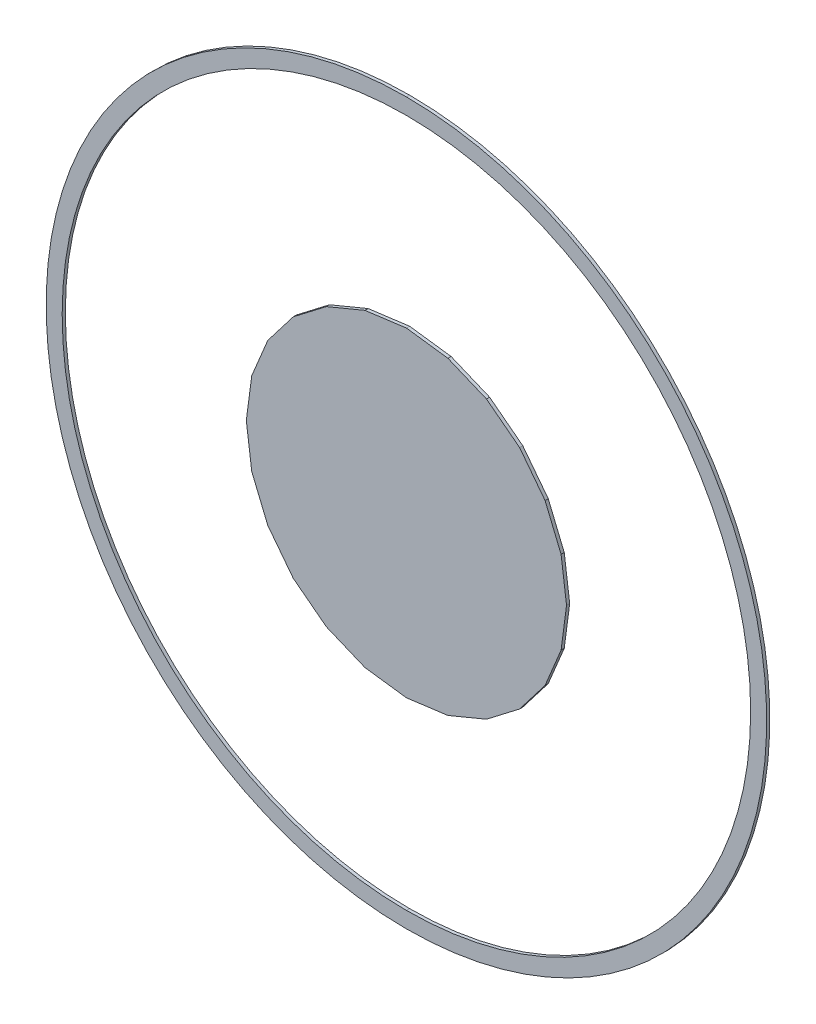
ISO-10303-21;
HEADER;
FILE_DESCRIPTION(('STEP AP214'),'2;1');
FILE_NAME('part.step','',(''),(''),'','','');
FILE_SCHEMA(('AUTOMOTIVE_DESIGN { 1 0 10303 214 1 1 1 1 }'));
ENDSEC;
DATA;
#1=APPLICATION_CONTEXT('core data for automotive mechanical design processes');
#2=APPLICATION_PROTOCOL_DEFINITION('international standard','automotive_design',2000,#1);
#3=PRODUCT_CONTEXT('',#1,'mechanical');
#4=PRODUCT('Part','Part','',(#3));
#5=PRODUCT_RELATED_PRODUCT_CATEGORY('part','',(#4));
#6=PRODUCT_DEFINITION_FORMATION('','',#4);
#7=PRODUCT_DEFINITION_CONTEXT('part definition',#1,'design');
#8=PRODUCT_DEFINITION('design','',#6,#7);
#9=PRODUCT_DEFINITION_SHAPE('','',#8);
#10=(LENGTH_UNIT() NAMED_UNIT(*) SI_UNIT(.MILLI.,.METRE.));
#11=(NAMED_UNIT(*) PLANE_ANGLE_UNIT() SI_UNIT($,.RADIAN.));
#12=(NAMED_UNIT(*) SI_UNIT($,.STERADIAN.) SOLID_ANGLE_UNIT());
#13=UNCERTAINTY_MEASURE_WITH_UNIT(LENGTH_MEASURE(1.E-05),#10,'distance_accuracy_value','');
#14=(GEOMETRIC_REPRESENTATION_CONTEXT(3) GLOBAL_UNCERTAINTY_ASSIGNED_CONTEXT((#13)) GLOBAL_UNIT_ASSIGNED_CONTEXT((#10,
#11,#12)) REPRESENTATION_CONTEXT('',''));
#15=CARTESIAN_POINT('',(0.,0.,0.));
#16=DIRECTION('',(0.,0.,1.));
#17=DIRECTION('',(1.,0.,0.));
#18=AXIS2_PLACEMENT_3D('',#15,#16,#17);
#19=CARTESIAN_POINT('',(0.,0.508,0.));
#20=DIRECTION('',(-0.130157426935396,0.991493340478673,0.));
#21=DIRECTION('',(0.,0.,1.));
#22=AXIS2_PLACEMENT_3D('',#19,#20,#21);
#23=PLANE('',#22);
#24=DIRECTION('',(0.,0.,1.));
#25=VECTOR('',#24,1.);
#26=CARTESIAN_POINT('',(-0.131572,0.490728,0.));
#27=LINE('',#26,#25);
#28=CARTESIAN_POINT('',(-0.131572,0.490728,0.));
#29=VERTEX_POINT('',#28);
#30=CARTESIAN_POINT('',(-0.131572,0.490728,0.01));
#31=VERTEX_POINT('',#30);
#32=EDGE_CURVE('P0_E11',#29,#31,#27,.T.);
#33=ORIENTED_EDGE('',*,*,#32,.T.);
#34=DIRECTION('',(-0.991493340478673,-0.130157426935396,0.));
#35=VECTOR('',#34,1.);
#36=CARTESIAN_POINT('',(0.,0.508,0.01));
#37=LINE('',#36,#35);
#38=CARTESIAN_POINT('',(0.,0.508,0.01));
#39=VERTEX_POINT('',#38);
#40=EDGE_CURVE('P0_E438',#39,#31,#37,.T.);
#41=ORIENTED_EDGE('',*,*,#40,.F.);
#42=DIRECTION('',(0.,0.,1.));
#43=VECTOR('',#42,1.);
#44=CARTESIAN_POINT('',(0.,0.508,0.));
#45=LINE('',#44,#43);
#46=CARTESIAN_POINT('',(0.,0.508,0.));
#47=VERTEX_POINT('',#46);
#48=EDGE_CURVE('P0_E322',#47,#39,#45,.T.);
#49=ORIENTED_EDGE('',*,*,#48,.F.);
#50=DIRECTION('',(0.991493340478673,0.130157426935396,0.));
#51=VECTOR('',#50,1.);
#52=CARTESIAN_POINT('',(-0.131572,0.490728,0.));
#53=LINE('',#52,#51);
#54=EDGE_CURVE('P0_E285',#29,#47,#53,.T.);
#55=ORIENTED_EDGE('',*,*,#54,.F.);
#56=EDGE_LOOP('',(#33,#41,#49,#55));
#57=FACE_BOUND('',#56,.T.);
#58=ADVANCED_FACE('P0_F18',(#57),#23,.T.);
#59=CARTESIAN_POINT('',(-0.131572,0.490728,0.));
#60=DIRECTION('',(-0.383254300605684,0.923642864459661,0.));
#61=DIRECTION('',(0.,0.,1.));
#62=AXIS2_PLACEMENT_3D('',#59,#60,#61);
#63=PLANE('',#62);
#64=DIRECTION('',(0.,0.,1.));
#65=VECTOR('',#64,1.);
#66=CARTESIAN_POINT('',(-0.254,0.439928,0.));
#67=LINE('',#66,#65);
#68=CARTESIAN_POINT('',(-0.254,0.439928,0.));
#69=VERTEX_POINT('',#68);
#70=CARTESIAN_POINT('',(-0.254,0.439928,0.01));
#71=VERTEX_POINT('',#70);
#72=EDGE_CURVE('P0_E29',#69,#71,#67,.T.);
#73=ORIENTED_EDGE('',*,*,#72,.T.);
#74=DIRECTION('',(-0.923642864459661,-0.383254300605684,0.));
#75=VECTOR('',#74,1.);
#76=CARTESIAN_POINT('',(-0.131572,0.490728,0.01));
#77=LINE('',#76,#75);
#78=EDGE_CURVE('P0_E364',#31,#71,#77,.T.);
#79=ORIENTED_EDGE('',*,*,#78,.F.);
#80=ORIENTED_EDGE('',*,*,#32,.F.);
#81=DIRECTION('',(0.923642864459661,0.383254300605684,0.));
#82=VECTOR('',#81,1.);
#83=CARTESIAN_POINT('',(-0.254,0.439928,0.));
#84=LINE('',#83,#82);
#85=EDGE_CURVE('P0_E252',#69,#29,#84,.T.);
#86=ORIENTED_EDGE('',*,*,#85,.F.);
#87=EDGE_LOOP('',(#73,#79,#80,#86));
#88=FACE_BOUND('',#87,.T.);
#89=ADVANCED_FACE('P0_F541',(#88),#63,.T.);
#90=CARTESIAN_POINT('',(-0.254,0.439928,0.));
#91=DIRECTION('',(-0.609155163492906,0.793051061905808,0.));
#92=DIRECTION('',(0.,0.,1.));
#93=AXIS2_PLACEMENT_3D('',#90,#91,#92);
#94=PLANE('',#93);
#95=DIRECTION('',(0.,0.,1.));
#96=VECTOR('',#95,1.);
#97=CARTESIAN_POINT('',(-0.359156,0.359156,0.));
#98=LINE('',#97,#96);
#99=CARTESIAN_POINT('',(-0.359156,0.359156,0.));
#100=VERTEX_POINT('',#99);
#101=CARTESIAN_POINT('',(-0.359156,0.359156,0.01));
#102=VERTEX_POINT('',#101);
#103=EDGE_CURVE('P0_E231',#100,#102,#98,.T.);
#104=ORIENTED_EDGE('',*,*,#103,.T.);
#105=DIRECTION('',(-0.793051061905808,-0.609155163492907,0.));
#106=VECTOR('',#105,1.);
#107=CARTESIAN_POINT('',(-0.254,0.439928,0.01));
#108=LINE('',#107,#106);
#109=EDGE_CURVE('P0_E348',#71,#102,#108,.T.);
#110=ORIENTED_EDGE('',*,*,#109,.F.);
#111=ORIENTED_EDGE('',*,*,#72,.F.);
#112=DIRECTION('',(0.793051061905808,0.609155163492907,0.));
#113=VECTOR('',#112,1.);
#114=CARTESIAN_POINT('',(-0.359156,0.359156,0.));
#115=LINE('',#114,#113);
#116=EDGE_CURVE('P0_E246',#100,#69,#115,.T.);
#117=ORIENTED_EDGE('',*,*,#116,.F.);
#118=EDGE_LOOP('',(#104,#110,#111,#117));
#119=FACE_BOUND('',#118,.T.);
#120=ADVANCED_FACE('P0_F247',(#119),#94,.T.);
#121=CARTESIAN_POINT('',(-0.359156,0.359156,0.));
#122=DIRECTION('',(-0.793051061905808,0.609155163492906,0.));
#123=DIRECTION('',(0.,0.,1.));
#124=AXIS2_PLACEMENT_3D('',#121,#122,#123);
#125=PLANE('',#124);
#126=DIRECTION('',(0.,0.,1.));
#127=VECTOR('',#126,1.);
#128=CARTESIAN_POINT('',(-0.439928,0.254,0.));
#129=LINE('',#128,#127);
#130=CARTESIAN_POINT('',(-0.439928,0.254,0.));
#131=VERTEX_POINT('',#130);
#132=CARTESIAN_POINT('',(-0.439928,0.254,0.01));
#133=VERTEX_POINT('',#132);
#134=EDGE_CURVE('P0_E243',#131,#133,#129,.T.);
#135=ORIENTED_EDGE('',*,*,#134,.T.);
#136=DIRECTION('',(-0.609155163492907,-0.793051061905808,0.));
#137=VECTOR('',#136,1.);
#138=CARTESIAN_POINT('',(-0.359156,0.359156,0.01));
#139=LINE('',#138,#137);
#140=EDGE_CURVE('P0_E238',#102,#133,#139,.T.);
#141=ORIENTED_EDGE('',*,*,#140,.F.);
#142=ORIENTED_EDGE('',*,*,#103,.F.);
#143=DIRECTION('',(0.609155163492907,0.793051061905808,0.));
#144=VECTOR('',#143,1.);
#145=CARTESIAN_POINT('',(-0.439928,0.254,0.));
#146=LINE('',#145,#144);
#147=EDGE_CURVE('P0_E235',#131,#100,#146,.T.);
#148=ORIENTED_EDGE('',*,*,#147,.F.);
#149=EDGE_LOOP('',(#135,#141,#142,#148));
#150=FACE_BOUND('',#149,.T.);
#151=ADVANCED_FACE('P0_F233',(#150),#125,.T.);
#152=CARTESIAN_POINT('',(-0.439928,0.254,0.));
#153=DIRECTION('',(-0.923642864459661,0.383254300605684,0.));
#154=DIRECTION('',(0.,0.,1.));
#155=AXIS2_PLACEMENT_3D('',#152,#153,#154);
#156=PLANE('',#155);
#157=DIRECTION('',(0.,0.,1.));
#158=VECTOR('',#157,1.);
#159=CARTESIAN_POINT('',(-0.490728,0.131572,0.));
#160=LINE('',#159,#158);
#161=CARTESIAN_POINT('',(-0.490728,0.131572,0.));
#162=VERTEX_POINT('',#161);
#163=CARTESIAN_POINT('',(-0.490728,0.131572,0.01));
#164=VERTEX_POINT('',#163);
#165=EDGE_CURVE('P0_E371',#162,#164,#160,.T.);
#166=ORIENTED_EDGE('',*,*,#165,.T.);
#167=DIRECTION('',(-0.383254300605684,-0.923642864459661,0.));
#168=VECTOR('',#167,1.);
#169=CARTESIAN_POINT('',(-0.439928,0.254,0.01));
#170=LINE('',#169,#168);
#171=EDGE_CURVE('P0_E347',#133,#164,#170,.T.);
#172=ORIENTED_EDGE('',*,*,#171,.F.);
#173=ORIENTED_EDGE('',*,*,#134,.F.);
#174=DIRECTION('',(0.383254300605684,0.923642864459661,0.));
#175=VECTOR('',#174,1.);
#176=CARTESIAN_POINT('',(-0.490728,0.131572,0.));
#177=LINE('',#176,#175);
#178=EDGE_CURVE('P0_E257',#162,#131,#177,.T.);
#179=ORIENTED_EDGE('',*,*,#178,.F.);
#180=EDGE_LOOP('',(#166,#172,#173,#179));
#181=FACE_BOUND('',#180,.T.);
#182=ADVANCED_FACE('P0_F530',(#181),#156,.T.);
#183=CARTESIAN_POINT('',(-0.490728,0.131572,0.));
#184=DIRECTION('',(-0.991493340478673,0.130157426935396,0.));
#185=DIRECTION('',(0.,0.,1.));
#186=AXIS2_PLACEMENT_3D('',#183,#184,#185);
#187=PLANE('',#186);
#188=DIRECTION('',(0.,0.,1.));
#189=VECTOR('',#188,1.);
#190=CARTESIAN_POINT('',(-0.508,0.,0.));
#191=LINE('',#190,#189);
#192=CARTESIAN_POINT('',(-0.508,0.,0.));
#193=VERTEX_POINT('',#192);
#194=CARTESIAN_POINT('',(-0.508,0.,0.01));
#195=VERTEX_POINT('',#194);
#196=EDGE_CURVE('P0_E396',#193,#195,#191,.T.);
#197=ORIENTED_EDGE('',*,*,#196,.T.);
#198=DIRECTION('',(-0.130157426935396,-0.991493340478673,0.));
#199=VECTOR('',#198,1.);
#200=CARTESIAN_POINT('',(-0.490728,0.131572,0.01));
#201=LINE('',#200,#199);
#202=EDGE_CURVE('P0_E308',#164,#195,#201,.T.);
#203=ORIENTED_EDGE('',*,*,#202,.F.);
#204=ORIENTED_EDGE('',*,*,#165,.F.);
#205=DIRECTION('',(0.130157426935396,0.991493340478673,0.));
#206=VECTOR('',#205,1.);
#207=CARTESIAN_POINT('',(-0.508,0.,0.));
#208=LINE('',#207,#206);
#209=EDGE_CURVE('P0_E266',#193,#162,#208,.T.);
#210=ORIENTED_EDGE('',*,*,#209,.F.);
#211=EDGE_LOOP('',(#197,#203,#204,#210));
#212=FACE_BOUND('',#211,.T.);
#213=ADVANCED_FACE('P0_F535',(#212),#187,.T.);
#214=CARTESIAN_POINT('',(-0.508,0.,0.));
#215=DIRECTION('',(-0.991493340478673,-0.130157426935396,0.));
#216=DIRECTION('',(-0.130157426935396,0.991493340478673,0.));
#217=AXIS2_PLACEMENT_3D('',#214,#215,#216);
#218=PLANE('',#217);
#219=DIRECTION('',(0.,0.,1.));
#220=VECTOR('',#219,1.);
#221=CARTESIAN_POINT('',(-0.490728,-0.131572,0.));
#222=LINE('',#221,#220);
#223=CARTESIAN_POINT('',(-0.490728,-0.131572,0.));
#224=VERTEX_POINT('',#223);
#225=CARTESIAN_POINT('',(-0.490728,-0.131572,0.01));
#226=VERTEX_POINT('',#225);
#227=EDGE_CURVE('P0_E355',#224,#226,#222,.T.);
#228=ORIENTED_EDGE('',*,*,#227,.T.);
#229=DIRECTION('',(0.130157426935396,-0.991493340478673,0.));
#230=VECTOR('',#229,1.);
#231=CARTESIAN_POINT('',(-0.508,0.,0.01));
#232=LINE('',#231,#230);
#233=EDGE_CURVE('P0_E303',#195,#226,#232,.T.);
#234=ORIENTED_EDGE('',*,*,#233,.F.);
#235=ORIENTED_EDGE('',*,*,#196,.F.);
#236=DIRECTION('',(-0.130157426935396,0.991493340478673,0.));
#237=VECTOR('',#236,1.);
#238=CARTESIAN_POINT('',(-0.490728,-0.131572,0.));
#239=LINE('',#238,#237);
#240=EDGE_CURVE('P0_E359',#224,#193,#239,.T.);
#241=ORIENTED_EDGE('',*,*,#240,.F.);
#242=EDGE_LOOP('',(#228,#234,#235,#241));
#243=FACE_BOUND('',#242,.T.);
#244=ADVANCED_FACE('P0_F1020',(#243),#218,.T.);
#245=CARTESIAN_POINT('',(-0.490728,-0.131572,0.));
#246=DIRECTION('',(-0.923642864459661,-0.383254300605684,0.));
#247=DIRECTION('',(-0.383254300605684,0.923642864459661,0.));
#248=AXIS2_PLACEMENT_3D('',#245,#246,#247);
#249=PLANE('',#248);
#250=DIRECTION('',(0.,0.,1.));
#251=VECTOR('',#250,1.);
#252=CARTESIAN_POINT('',(-0.439928,-0.254,0.));
#253=LINE('',#252,#251);
#254=CARTESIAN_POINT('',(-0.439928,-0.254,0.));
#255=VERTEX_POINT('',#254);
#256=CARTESIAN_POINT('',(-0.439928,-0.254,0.01));
#257=VERTEX_POINT('',#256);
#258=EDGE_CURVE('P0_E352',#255,#257,#253,.T.);
#259=ORIENTED_EDGE('',*,*,#258,.T.);
#260=DIRECTION('',(0.383254300605684,-0.923642864459661,0.));
#261=VECTOR('',#260,1.);
#262=CARTESIAN_POINT('',(-0.490728,-0.131572,0.01));
#263=LINE('',#262,#261);
#264=EDGE_CURVE('P0_E307',#226,#257,#263,.T.);
#265=ORIENTED_EDGE('',*,*,#264,.F.);
#266=ORIENTED_EDGE('',*,*,#227,.F.);
#267=DIRECTION('',(-0.383254300605684,0.923642864459661,0.));
#268=VECTOR('',#267,1.);
#269=CARTESIAN_POINT('',(-0.439928,-0.254,0.));
#270=LINE('',#269,#268);
#271=EDGE_CURVE('P0_E404',#255,#224,#270,.T.);
#272=ORIENTED_EDGE('',*,*,#271,.F.);
#273=EDGE_LOOP('',(#259,#265,#266,#272));
#274=FACE_BOUND('',#273,.T.);
#275=ADVANCED_FACE('P0_F1014',(#274),#249,.T.);
#276=CARTESIAN_POINT('',(-0.439928,-0.254,0.));
#277=DIRECTION('',(-0.793051061905808,-0.609155163492906,0.));
#278=DIRECTION('',(-0.609155163492906,0.793051061905808,0.));
#279=AXIS2_PLACEMENT_3D('',#276,#277,#278);
#280=PLANE('',#279);
#281=DIRECTION('',(0.,0.,1.));
#282=VECTOR('',#281,1.);
#283=CARTESIAN_POINT('',(-0.359156,-0.359156,0.));
#284=LINE('',#283,#282);
#285=CARTESIAN_POINT('',(-0.359156,-0.359156,0.));
#286=VERTEX_POINT('',#285);
#287=CARTESIAN_POINT('',(-0.359156,-0.359156,0.01));
#288=VERTEX_POINT('',#287);
#289=EDGE_CURVE('P0_E356',#286,#288,#284,.T.);
#290=ORIENTED_EDGE('',*,*,#289,.T.);
#291=DIRECTION('',(0.609155163492907,-0.793051061905808,0.));
#292=VECTOR('',#291,1.);
#293=CARTESIAN_POINT('',(-0.439928,-0.254,0.01));
#294=LINE('',#293,#292);
#295=EDGE_CURVE('P0_E468',#257,#288,#294,.T.);
#296=ORIENTED_EDGE('',*,*,#295,.F.);
#297=ORIENTED_EDGE('',*,*,#258,.F.);
#298=DIRECTION('',(-0.609155163492907,0.793051061905808,0.));
#299=VECTOR('',#298,1.);
#300=CARTESIAN_POINT('',(-0.359156,-0.359156,0.));
#301=LINE('',#300,#299);
#302=EDGE_CURVE('P0_E476',#286,#255,#301,.T.);
#303=ORIENTED_EDGE('',*,*,#302,.F.);
#304=EDGE_LOOP('',(#290,#296,#297,#303));
#305=FACE_BOUND('',#304,.T.);
#306=ADVANCED_FACE('P0_F1019',(#305),#280,.T.);
#307=CARTESIAN_POINT('',(-0.359156,-0.359156,0.));
#308=DIRECTION('',(-0.609155163492906,-0.793051061905808,0.));
#309=DIRECTION('',(-0.793051061905808,0.609155163492906,0.));
#310=AXIS2_PLACEMENT_3D('',#307,#308,#309);
#311=PLANE('',#310);
#312=DIRECTION('',(0.,0.,1.));
#313=VECTOR('',#312,1.);
#314=CARTESIAN_POINT('',(-0.254,-0.439928,0.));
#315=LINE('',#314,#313);
#316=CARTESIAN_POINT('',(-0.254,-0.439928,0.));
#317=VERTEX_POINT('',#316);
#318=CARTESIAN_POINT('',(-0.254,-0.439928,0.01));
#319=VERTEX_POINT('',#318);
#320=EDGE_CURVE('P0_E43',#317,#319,#315,.T.);
#321=ORIENTED_EDGE('',*,*,#320,.T.);
#322=DIRECTION('',(0.793051061905808,-0.609155163492907,0.));
#323=VECTOR('',#322,1.);
#324=CARTESIAN_POINT('',(-0.359156,-0.359156,0.01));
#325=LINE('',#324,#323);
#326=EDGE_CURVE('P0_E374',#288,#319,#325,.T.);
#327=ORIENTED_EDGE('',*,*,#326,.F.);
#328=ORIENTED_EDGE('',*,*,#289,.F.);
#329=DIRECTION('',(-0.793051061905808,0.609155163492907,0.));
#330=VECTOR('',#329,1.);
#331=CARTESIAN_POINT('',(-0.254,-0.439928,0.));
#332=LINE('',#331,#330);
#333=EDGE_CURVE('P0_E389',#317,#286,#332,.T.);
#334=ORIENTED_EDGE('',*,*,#333,.F.);
#335=EDGE_LOOP('',(#321,#327,#328,#334));
#336=FACE_BOUND('',#335,.T.);
#337=ADVANCED_FACE('P0_F1056',(#336),#311,.T.);
#338=CARTESIAN_POINT('',(-0.254,-0.439928,0.));
#339=DIRECTION('',(-0.383254300605684,-0.923642864459661,0.));
#340=DIRECTION('',(-0.923642864459661,0.383254300605684,0.));
#341=AXIS2_PLACEMENT_3D('',#338,#339,#340);
#342=PLANE('',#341);
#343=DIRECTION('',(0.,0.,1.));
#344=VECTOR('',#343,1.);
#345=CARTESIAN_POINT('',(-0.131572,-0.490728,0.));
#346=LINE('',#345,#344);
#347=CARTESIAN_POINT('',(-0.131572,-0.490728,0.));
#348=VERTEX_POINT('',#347);
#349=CARTESIAN_POINT('',(-0.131572,-0.490728,0.01));
#350=VERTEX_POINT('',#349);
#351=EDGE_CURVE('P0_E22',#348,#350,#346,.T.);
#352=ORIENTED_EDGE('',*,*,#351,.T.);
#353=DIRECTION('',(0.923642864459661,-0.383254300605684,0.));
#354=VECTOR('',#353,1.);
#355=CARTESIAN_POINT('',(-0.254,-0.439928,0.01));
#356=LINE('',#355,#354);
#357=EDGE_CURVE('P0_E372',#319,#350,#356,.T.);
#358=ORIENTED_EDGE('',*,*,#357,.F.);
#359=ORIENTED_EDGE('',*,*,#320,.F.);
#360=DIRECTION('',(-0.923642864459661,0.383254300605684,0.));
#361=VECTOR('',#360,1.);
#362=CARTESIAN_POINT('',(-0.131572,-0.490728,0.));
#363=LINE('',#362,#361);
#364=EDGE_CURVE('P0_E333',#348,#317,#363,.T.);
#365=ORIENTED_EDGE('',*,*,#364,.F.);
#366=EDGE_LOOP('',(#352,#358,#359,#365));
#367=FACE_BOUND('',#366,.T.);
#368=ADVANCED_FACE('P0_F20',(#367),#342,.T.);
#369=CARTESIAN_POINT('',(0.,0.,0.01));
#370=DIRECTION('',(0.,0.,1.));
#371=DIRECTION('',(1.,0.,0.));
#372=AXIS2_PLACEMENT_3D('',#369,#370,#371);
#373=PLANE('',#372);
#374=ORIENTED_EDGE('',*,*,#40,.T.);
#375=ORIENTED_EDGE('',*,*,#78,.T.);
#376=ORIENTED_EDGE('',*,*,#109,.T.);
#377=ORIENTED_EDGE('',*,*,#140,.T.);
#378=ORIENTED_EDGE('',*,*,#171,.T.);
#379=ORIENTED_EDGE('',*,*,#202,.T.);
#380=ORIENTED_EDGE('',*,*,#233,.T.);
#381=ORIENTED_EDGE('',*,*,#264,.T.);
#382=ORIENTED_EDGE('',*,*,#295,.T.);
#383=ORIENTED_EDGE('',*,*,#326,.T.);
#384=ORIENTED_EDGE('',*,*,#357,.T.);
#385=DIRECTION('',(0.991493340478673,-0.130157426935396,0.));
#386=VECTOR('',#385,1.);
#387=CARTESIAN_POINT('',(-0.131572,-0.490728,0.01));
#388=LINE('',#387,#386);
#389=CARTESIAN_POINT('',(0.,-0.508,0.01));
#390=VERTEX_POINT('',#389);
#391=EDGE_CURVE('P0_E316',#350,#390,#388,.T.);
#392=ORIENTED_EDGE('',*,*,#391,.T.);
#393=DIRECTION('',(0.991493340478673,0.130157426935396,0.));
#394=VECTOR('',#393,1.);
#395=CARTESIAN_POINT('',(0.,-0.508,0.01));
#396=LINE('',#395,#394);
#397=CARTESIAN_POINT('',(0.131572,-0.490728,0.01));
#398=VERTEX_POINT('',#397);
#399=EDGE_CURVE('P0_E435',#390,#398,#396,.T.);
#400=ORIENTED_EDGE('',*,*,#399,.T.);
#401=DIRECTION('',(0.923642864459661,0.383254300605684,0.));
#402=VECTOR('',#401,1.);
#403=CARTESIAN_POINT('',(0.131572,-0.490728,0.01));
#404=LINE('',#403,#402);
#405=CARTESIAN_POINT('',(0.254,-0.439928,0.01));
#406=VERTEX_POINT('',#405);
#407=EDGE_CURVE('P0_E277',#398,#406,#404,.T.);
#408=ORIENTED_EDGE('',*,*,#407,.T.);
#409=DIRECTION('',(0.793051061905808,0.609155163492907,0.));
#410=VECTOR('',#409,1.);
#411=CARTESIAN_POINT('',(0.254,-0.439928,0.01));
#412=LINE('',#411,#410);
#413=CARTESIAN_POINT('',(0.359156,-0.359156,0.01));
#414=VERTEX_POINT('',#413);
#415=EDGE_CURVE('P0_E278',#406,#414,#412,.T.);
#416=ORIENTED_EDGE('',*,*,#415,.T.);
#417=DIRECTION('',(0.609155163492907,0.793051061905808,0.));
#418=VECTOR('',#417,1.);
#419=CARTESIAN_POINT('',(0.359156,-0.359156,0.01));
#420=LINE('',#419,#418);
#421=CARTESIAN_POINT('',(0.439928,-0.254,0.01));
#422=VERTEX_POINT('',#421);
#423=EDGE_CURVE('P0_E197',#414,#422,#420,.T.);
#424=ORIENTED_EDGE('',*,*,#423,.T.);
#425=DIRECTION('',(0.383254300605684,0.923642864459661,0.));
#426=VECTOR('',#425,1.);
#427=CARTESIAN_POINT('',(0.439928,-0.254,0.01));
#428=LINE('',#427,#426);
#429=CARTESIAN_POINT('',(0.490728,-0.131572,0.01));
#430=VERTEX_POINT('',#429);
#431=EDGE_CURVE('P0_E207',#422,#430,#428,.T.);
#432=ORIENTED_EDGE('',*,*,#431,.T.);
#433=DIRECTION('',(0.130157426935396,0.991493340478673,0.));
#434=VECTOR('',#433,1.);
#435=CARTESIAN_POINT('',(0.490728,-0.131572,0.01));
#436=LINE('',#435,#434);
#437=CARTESIAN_POINT('',(0.508,0.,0.01));
#438=VERTEX_POINT('',#437);
#439=EDGE_CURVE('P0_E365',#430,#438,#436,.T.);
#440=ORIENTED_EDGE('',*,*,#439,.T.);
#441=DIRECTION('',(-0.130157426935396,0.991493340478673,0.));
#442=VECTOR('',#441,1.);
#443=CARTESIAN_POINT('',(0.508,0.,0.01));
#444=LINE('',#443,#442);
#445=CARTESIAN_POINT('',(0.490728,0.131572,0.01));
#446=VERTEX_POINT('',#445);
#447=EDGE_CURVE('P0_E300',#438,#446,#444,.T.);
#448=ORIENTED_EDGE('',*,*,#447,.T.);
#449=DIRECTION('',(-0.383254300605684,0.923642864459661,0.));
#450=VECTOR('',#449,1.);
#451=CARTESIAN_POINT('',(0.490728,0.131572,0.01));
#452=LINE('',#451,#450);
#453=CARTESIAN_POINT('',(0.439928,0.254,0.01));
#454=VERTEX_POINT('',#453);
#455=EDGE_CURVE('P0_E294',#446,#454,#452,.T.);
#456=ORIENTED_EDGE('',*,*,#455,.T.);
#457=DIRECTION('',(-0.609155163492907,0.793051061905808,0.));
#458=VECTOR('',#457,1.);
#459=CARTESIAN_POINT('',(0.439928,0.254,0.01));
#460=LINE('',#459,#458);
#461=CARTESIAN_POINT('',(0.359156,0.359156,0.01));
#462=VERTEX_POINT('',#461);
#463=EDGE_CURVE('P0_E295',#454,#462,#460,.T.);
#464=ORIENTED_EDGE('',*,*,#463,.T.);
#465=DIRECTION('',(-0.793051061905808,0.609155163492907,0.));
#466=VECTOR('',#465,1.);
#467=CARTESIAN_POINT('',(0.359156,0.359156,0.01));
#468=LINE('',#467,#466);
#469=CARTESIAN_POINT('',(0.254,0.439928,0.01));
#470=VERTEX_POINT('',#469);
#471=EDGE_CURVE('P0_E393',#462,#470,#468,.T.);
#472=ORIENTED_EDGE('',*,*,#471,.T.);
#473=DIRECTION('',(-0.923642864459661,0.383254300605684,0.));
#474=VECTOR('',#473,1.);
#475=CARTESIAN_POINT('',(0.254,0.439928,0.01));
#476=LINE('',#475,#474);
#477=CARTESIAN_POINT('',(0.131572,0.490728,0.01));
#478=VERTEX_POINT('',#477);
#479=EDGE_CURVE('P0_E340',#470,#478,#476,.T.);
#480=ORIENTED_EDGE('',*,*,#479,.T.);
#481=DIRECTION('',(-0.991493340478673,0.130157426935396,0.));
#482=VECTOR('',#481,1.);
#483=CARTESIAN_POINT('',(0.131572,0.490728,0.01));
#484=LINE('',#483,#482);
#485=EDGE_CURVE('P0_E326',#478,#39,#484,.T.);
#486=ORIENTED_EDGE('',*,*,#485,.T.);
#487=EDGE_LOOP('',(#374,#375,#376,#377,#378,#379,#380,#381,#382,#383,#384,#392,#400,#408,#416,
#424,#432,#440,#448,#456,#464,#472,#480,#486));
#488=FACE_BOUND('',#487,.T.);
#489=ADVANCED_FACE('P0_F537',(#488),#373,.T.);
#490=CARTESIAN_POINT('',(0.,-0.508,0.));
#491=DIRECTION('',(0.130157426935396,-0.991493340478673,0.));
#492=DIRECTION('',(0.,0.,-1.));
#493=AXIS2_PLACEMENT_3D('',#490,#491,#492);
#494=PLANE('',#493);
#495=DIRECTION('',(0.,0.,1.));
#496=VECTOR('',#495,1.);
#497=CARTESIAN_POINT('',(0.131572,-0.490728,0.));
#498=LINE('',#497,#496);
#499=CARTESIAN_POINT('',(0.131572,-0.490728,0.));
#500=VERTEX_POINT('',#499);
#501=EDGE_CURVE('P0_E382',#500,#398,#498,.T.);
#502=ORIENTED_EDGE('',*,*,#501,.T.);
#503=ORIENTED_EDGE('',*,*,#399,.F.);
#504=DIRECTION('',(0.,0.,1.));
#505=VECTOR('',#504,1.);
#506=CARTESIAN_POINT('',(0.,-0.508,0.));
#507=LINE('',#506,#505);
#508=CARTESIAN_POINT('',(0.,-0.508,0.));
#509=VERTEX_POINT('',#508);
#510=EDGE_CURVE('P0_E312',#509,#390,#507,.T.);
#511=ORIENTED_EDGE('',*,*,#510,.F.);
#512=DIRECTION('',(-0.991493340478673,-0.130157426935396,0.));
#513=VECTOR('',#512,1.);
#514=CARTESIAN_POINT('',(0.131572,-0.490728,0.));
#515=LINE('',#514,#513);
#516=EDGE_CURVE('P0_E330',#500,#509,#515,.T.);
#517=ORIENTED_EDGE('',*,*,#516,.F.);
#518=EDGE_LOOP('',(#502,#503,#511,#517));
#519=FACE_BOUND('',#518,.T.);
#520=ADVANCED_FACE('P0_F433',(#519),#494,.T.);
#521=CARTESIAN_POINT('',(0.131572,-0.490728,0.));
#522=DIRECTION('',(0.383254300605684,-0.923642864459661,0.));
#523=DIRECTION('',(0.,0.,-1.));
#524=AXIS2_PLACEMENT_3D('',#521,#522,#523);
#525=PLANE('',#524);
#526=DIRECTION('',(0.,0.,1.));
#527=VECTOR('',#526,1.);
#528=CARTESIAN_POINT('',(0.254,-0.439928,0.));
#529=LINE('',#528,#527);
#530=CARTESIAN_POINT('',(0.254,-0.439928,0.));
#531=VERTEX_POINT('',#530);
#532=EDGE_CURVE('P0_E273',#531,#406,#529,.T.);
#533=ORIENTED_EDGE('',*,*,#532,.T.);
#534=ORIENTED_EDGE('',*,*,#407,.F.);
#535=ORIENTED_EDGE('',*,*,#501,.F.);
#536=DIRECTION('',(-0.923642864459661,-0.383254300605684,0.));
#537=VECTOR('',#536,1.);
#538=CARTESIAN_POINT('',(0.254,-0.439928,0.));
#539=LINE('',#538,#537);
#540=EDGE_CURVE('P0_E334',#531,#500,#539,.T.);
#541=ORIENTED_EDGE('',*,*,#540,.F.);
#542=EDGE_LOOP('',(#533,#534,#535,#541));
#543=FACE_BOUND('',#542,.T.);
#544=ADVANCED_FACE('P0_F1104',(#543),#525,.T.);
#545=CARTESIAN_POINT('',(0.254,-0.439928,0.));
#546=DIRECTION('',(0.609155163492906,-0.793051061905808,0.));
#547=DIRECTION('',(0.,0.,-1.));
#548=AXIS2_PLACEMENT_3D('',#545,#546,#547);
#549=PLANE('',#548);
#550=DIRECTION('',(0.,0.,1.));
#551=VECTOR('',#550,1.);
#552=CARTESIAN_POINT('',(0.359156,-0.359156,0.));
#553=LINE('',#552,#551);
#554=CARTESIAN_POINT('',(0.359156,-0.359156,0.));
#555=VERTEX_POINT('',#554);
#556=EDGE_CURVE('P0_E270',#555,#414,#553,.T.);
#557=ORIENTED_EDGE('',*,*,#556,.T.);
#558=ORIENTED_EDGE('',*,*,#415,.F.);
#559=ORIENTED_EDGE('',*,*,#532,.F.);
#560=DIRECTION('',(-0.793051061905808,-0.609155163492907,0.));
#561=VECTOR('',#560,1.);
#562=CARTESIAN_POINT('',(0.359156,-0.359156,0.));
#563=LINE('',#562,#561);
#564=EDGE_CURVE('P0_E339',#555,#531,#563,.T.);
#565=ORIENTED_EDGE('',*,*,#564,.F.);
#566=EDGE_LOOP('',(#557,#558,#559,#565));
#567=FACE_BOUND('',#566,.T.);
#568=ADVANCED_FACE('P0_F503',(#567),#549,.T.);
#569=CARTESIAN_POINT('',(0.359156,-0.359156,0.));
#570=DIRECTION('',(0.793051061905808,-0.609155163492906,0.));
#571=DIRECTION('',(0.,0.,-1.));
#572=AXIS2_PLACEMENT_3D('',#569,#570,#571);
#573=PLANE('',#572);
#574=DIRECTION('',(0.,0.,1.));
#575=VECTOR('',#574,1.);
#576=CARTESIAN_POINT('',(0.439928,-0.254,0.));
#577=LINE('',#576,#575);
#578=CARTESIAN_POINT('',(0.439928,-0.254,0.));
#579=VERTEX_POINT('',#578);
#580=EDGE_CURVE('P0_E311',#579,#422,#577,.T.);
#581=ORIENTED_EDGE('',*,*,#580,.T.);
#582=ORIENTED_EDGE('',*,*,#423,.F.);
#583=ORIENTED_EDGE('',*,*,#556,.F.);
#584=DIRECTION('',(-0.609155163492907,-0.793051061905808,0.));
#585=VECTOR('',#584,1.);
#586=CARTESIAN_POINT('',(0.439928,-0.254,0.));
#587=LINE('',#586,#585);
#588=EDGE_CURVE('P0_E335',#579,#555,#587,.T.);
#589=ORIENTED_EDGE('',*,*,#588,.F.);
#590=EDGE_LOOP('',(#581,#582,#583,#589));
#591=FACE_BOUND('',#590,.T.);
#592=ADVANCED_FACE('P0_F497',(#591),#573,.T.);
#593=CARTESIAN_POINT('',(0.439928,-0.254,0.));
#594=DIRECTION('',(0.923642864459661,-0.383254300605684,0.));
#595=DIRECTION('',(0.,0.,-1.));
#596=AXIS2_PLACEMENT_3D('',#593,#594,#595);
#597=PLANE('',#596);
#598=DIRECTION('',(0.,0.,1.));
#599=VECTOR('',#598,1.);
#600=CARTESIAN_POINT('',(0.490728,-0.131572,0.));
#601=LINE('',#600,#599);
#602=CARTESIAN_POINT('',(0.490728,-0.131572,0.));
#603=VERTEX_POINT('',#602);
#604=EDGE_CURVE('P0_E329',#603,#430,#601,.T.);
#605=ORIENTED_EDGE('',*,*,#604,.T.);
#606=ORIENTED_EDGE('',*,*,#431,.F.);
#607=ORIENTED_EDGE('',*,*,#580,.F.);
#608=DIRECTION('',(-0.383254300605684,-0.923642864459661,0.));
#609=VECTOR('',#608,1.);
#610=CARTESIAN_POINT('',(0.490728,-0.131572,0.));
#611=LINE('',#610,#609);
#612=EDGE_CURVE('P0_E283',#603,#579,#611,.T.);
#613=ORIENTED_EDGE('',*,*,#612,.F.);
#614=EDGE_LOOP('',(#605,#606,#607,#613));
#615=FACE_BOUND('',#614,.T.);
#616=ADVANCED_FACE('P0_F493',(#615),#597,.T.);
#617=CARTESIAN_POINT('',(0.490728,-0.131572,0.));
#618=DIRECTION('',(0.991493340478673,-0.130157426935396,0.));
#619=DIRECTION('',(0.,0.,-1.));
#620=AXIS2_PLACEMENT_3D('',#617,#618,#619);
#621=PLANE('',#620);
#622=DIRECTION('',(0.,0.,1.));
#623=VECTOR('',#622,1.);
#624=CARTESIAN_POINT('',(0.508,0.,0.));
#625=LINE('',#624,#623);
#626=CARTESIAN_POINT('',(0.508,0.,0.));
#627=VERTEX_POINT('',#626);
#628=EDGE_CURVE('P0_E368',#627,#438,#625,.T.);
#629=ORIENTED_EDGE('',*,*,#628,.T.);
#630=ORIENTED_EDGE('',*,*,#439,.F.);
#631=ORIENTED_EDGE('',*,*,#604,.F.);
#632=DIRECTION('',(-0.130157426935396,-0.991493340478673,0.));
#633=VECTOR('',#632,1.);
#634=CARTESIAN_POINT('',(0.508,0.,0.));
#635=LINE('',#634,#633);
#636=EDGE_CURVE('P0_E279',#627,#603,#635,.T.);
#637=ORIENTED_EDGE('',*,*,#636,.F.);
#638=EDGE_LOOP('',(#629,#630,#631,#637));
#639=FACE_BOUND('',#638,.T.);
#640=ADVANCED_FACE('P0_F1082',(#639),#621,.T.);
#641=CARTESIAN_POINT('',(0.508,0.,0.));
#642=DIRECTION('',(0.991493340478673,0.130157426935396,0.));
#643=DIRECTION('',(0.,0.,-1.));
#644=AXIS2_PLACEMENT_3D('',#641,#642,#643);
#645=PLANE('',#644);
#646=DIRECTION('',(0.,0.,1.));
#647=VECTOR('',#646,1.);
#648=CARTESIAN_POINT('',(0.490728,0.131572,0.));
#649=LINE('',#648,#647);
#650=CARTESIAN_POINT('',(0.490728,0.131572,0.));
#651=VERTEX_POINT('',#650);
#652=EDGE_CURVE('P0_E296',#651,#446,#649,.T.);
#653=ORIENTED_EDGE('',*,*,#652,.T.);
#654=ORIENTED_EDGE('',*,*,#447,.F.);
#655=ORIENTED_EDGE('',*,*,#628,.F.);
#656=DIRECTION('',(0.130157426935396,-0.991493340478673,0.));
#657=VECTOR('',#656,1.);
#658=CARTESIAN_POINT('',(0.490728,0.131572,0.));
#659=LINE('',#658,#657);
#660=EDGE_CURVE('P0_E284',#651,#627,#659,.T.);
#661=ORIENTED_EDGE('',*,*,#660,.F.);
#662=EDGE_LOOP('',(#653,#654,#655,#661));
#663=FACE_BOUND('',#662,.T.);
#664=ADVANCED_FACE('P0_F1046',(#663),#645,.T.);
#665=CARTESIAN_POINT('',(0.490728,0.131572,0.));
#666=DIRECTION('',(0.923642864459661,0.383254300605684,0.));
#667=DIRECTION('',(0.,0.,-1.));
#668=AXIS2_PLACEMENT_3D('',#665,#666,#667);
#669=PLANE('',#668);
#670=DIRECTION('',(0.,0.,1.));
#671=VECTOR('',#670,1.);
#672=CARTESIAN_POINT('',(0.439928,0.254,0.));
#673=LINE('',#672,#671);
#674=CARTESIAN_POINT('',(0.439928,0.254,0.));
#675=VERTEX_POINT('',#674);
#676=EDGE_CURVE('P0_E290',#675,#454,#673,.T.);
#677=ORIENTED_EDGE('',*,*,#676,.T.);
#678=ORIENTED_EDGE('',*,*,#455,.F.);
#679=ORIENTED_EDGE('',*,*,#652,.F.);
#680=DIRECTION('',(0.383254300605684,-0.923642864459661,0.));
#681=VECTOR('',#680,1.);
#682=CARTESIAN_POINT('',(0.439928,0.254,0.));
#683=LINE('',#682,#681);
#684=EDGE_CURVE('P0_E317',#675,#651,#683,.T.);
#685=ORIENTED_EDGE('',*,*,#684,.F.);
#686=EDGE_LOOP('',(#677,#678,#679,#685));
#687=FACE_BOUND('',#686,.T.);
#688=ADVANCED_FACE('P0_F1040',(#687),#669,.T.);
#689=CARTESIAN_POINT('',(0.439928,0.254,0.));
#690=DIRECTION('',(0.793051061905808,0.609155163492906,0.));
#691=DIRECTION('',(0.,0.,-1.));
#692=AXIS2_PLACEMENT_3D('',#689,#690,#691);
#693=PLANE('',#692);
#694=DIRECTION('',(0.,0.,1.));
#695=VECTOR('',#694,1.);
#696=CARTESIAN_POINT('',(0.359156,0.359156,0.));
#697=LINE('',#696,#695);
#698=CARTESIAN_POINT('',(0.359156,0.359156,0.));
#699=VERTEX_POINT('',#698);
#700=EDGE_CURVE('P0_E472',#699,#462,#697,.T.);
#701=ORIENTED_EDGE('',*,*,#700,.T.);
#702=ORIENTED_EDGE('',*,*,#463,.F.);
#703=ORIENTED_EDGE('',*,*,#676,.F.);
#704=DIRECTION('',(0.609155163492907,-0.793051061905808,0.));
#705=VECTOR('',#704,1.);
#706=CARTESIAN_POINT('',(0.359156,0.359156,0.));
#707=LINE('',#706,#705);
#708=EDGE_CURVE('P0_E321',#699,#675,#707,.T.);
#709=ORIENTED_EDGE('',*,*,#708,.F.);
#710=EDGE_LOOP('',(#701,#702,#703,#709));
#711=FACE_BOUND('',#710,.T.);
#712=ADVANCED_FACE('P0_F1045',(#711),#693,.T.);
#713=CARTESIAN_POINT('',(0.359156,0.359156,0.));
#714=DIRECTION('',(0.609155163492906,0.793051061905808,0.));
#715=DIRECTION('',(0.,0.,-1.));
#716=AXIS2_PLACEMENT_3D('',#713,#714,#715);
#717=PLANE('',#716);
#718=DIRECTION('',(0.,0.,1.));
#719=VECTOR('',#718,1.);
#720=CARTESIAN_POINT('',(0.254,0.439928,0.));
#721=LINE('',#720,#719);
#722=CARTESIAN_POINT('',(0.254,0.439928,0.));
#723=VERTEX_POINT('',#722);
#724=EDGE_CURVE('P0_E343',#723,#470,#721,.T.);
#725=ORIENTED_EDGE('',*,*,#724,.T.);
#726=ORIENTED_EDGE('',*,*,#471,.F.);
#727=ORIENTED_EDGE('',*,*,#700,.F.);
#728=DIRECTION('',(0.793051061905808,-0.609155163492907,0.));
#729=VECTOR('',#728,1.);
#730=CARTESIAN_POINT('',(0.254,0.439928,0.));
#731=LINE('',#730,#729);
#732=EDGE_CURVE('P0_E379',#723,#699,#731,.T.);
#733=ORIENTED_EDGE('',*,*,#732,.F.);
#734=EDGE_LOOP('',(#725,#726,#727,#733));
#735=FACE_BOUND('',#734,.T.);
#736=ADVANCED_FACE('P0_F1127',(#735),#717,.T.);
#737=CARTESIAN_POINT('',(0.254,0.439928,0.));
#738=DIRECTION('',(0.383254300605684,0.923642864459661,0.));
#739=DIRECTION('',(0.,0.,-1.));
#740=AXIS2_PLACEMENT_3D('',#737,#738,#739);
#741=PLANE('',#740);
#742=DIRECTION('',(0.,0.,-1.));
#743=VECTOR('',#742,1.);
#744=CARTESIAN_POINT('',(0.131572,0.490728,0.01));
#745=LINE('',#744,#743);
#746=CARTESIAN_POINT('',(0.131572,0.490728,0.));
#747=VERTEX_POINT('',#746);
#748=EDGE_CURVE('P0_E344',#478,#747,#745,.T.);
#749=ORIENTED_EDGE('',*,*,#748,.F.);
#750=ORIENTED_EDGE('',*,*,#479,.F.);
#751=ORIENTED_EDGE('',*,*,#724,.F.);
#752=DIRECTION('',(0.923642864459661,-0.383254300605684,0.));
#753=VECTOR('',#752,1.);
#754=CARTESIAN_POINT('',(0.131572,0.490728,0.));
#755=LINE('',#754,#753);
#756=EDGE_CURVE('P0_E401',#747,#723,#755,.T.);
#757=ORIENTED_EDGE('',*,*,#756,.F.);
#758=EDGE_LOOP('',(#749,#750,#751,#757));
#759=FACE_BOUND('',#758,.T.);
#760=ADVANCED_FACE('P0_F1122',(#759),#741,.T.);
#761=CARTESIAN_POINT('',(0.131572,0.490728,0.));
#762=DIRECTION('',(0.130157426935396,0.991493340478673,0.));
#763=DIRECTION('',(0.,0.,-1.));
#764=AXIS2_PLACEMENT_3D('',#761,#762,#763);
#765=PLANE('',#764);
#766=ORIENTED_EDGE('',*,*,#48,.T.);
#767=ORIENTED_EDGE('',*,*,#485,.F.);
#768=ORIENTED_EDGE('',*,*,#748,.T.);
#769=DIRECTION('',(0.991493340478673,-0.130157426935396,0.));
#770=VECTOR('',#769,1.);
#771=CARTESIAN_POINT('',(0.,0.508,0.));
#772=LINE('',#771,#770);
#773=EDGE_CURVE('P0_E289',#47,#747,#772,.T.);
#774=ORIENTED_EDGE('',*,*,#773,.F.);
#775=EDGE_LOOP('',(#766,#767,#768,#774));
#776=FACE_BOUND('',#775,.T.);
#777=ADVANCED_FACE('P0_F551',(#776),#765,.T.);
#778=CARTESIAN_POINT('',(0.,0.,0.));
#779=DIRECTION('',(0.,0.,1.));
#780=DIRECTION('',(1.,0.,0.));
#781=AXIS2_PLACEMENT_3D('',#778,#779,#780);
#782=PLANE('',#781);
#783=ORIENTED_EDGE('',*,*,#756,.T.);
#784=ORIENTED_EDGE('',*,*,#732,.T.);
#785=ORIENTED_EDGE('',*,*,#708,.T.);
#786=ORIENTED_EDGE('',*,*,#684,.T.);
#787=ORIENTED_EDGE('',*,*,#660,.T.);
#788=ORIENTED_EDGE('',*,*,#636,.T.);
#789=ORIENTED_EDGE('',*,*,#612,.T.);
#790=ORIENTED_EDGE('',*,*,#588,.T.);
#791=ORIENTED_EDGE('',*,*,#564,.T.);
#792=ORIENTED_EDGE('',*,*,#540,.T.);
#793=ORIENTED_EDGE('',*,*,#516,.T.);
#794=DIRECTION('',(-0.991493340478673,0.130157426935396,0.));
#795=VECTOR('',#794,1.);
#796=CARTESIAN_POINT('',(0.,-0.508,0.));
#797=LINE('',#796,#795);
#798=EDGE_CURVE('P0_E397',#509,#348,#797,.T.);
#799=ORIENTED_EDGE('',*,*,#798,.T.);
#800=ORIENTED_EDGE('',*,*,#364,.T.);
#801=ORIENTED_EDGE('',*,*,#333,.T.);
#802=ORIENTED_EDGE('',*,*,#302,.T.);
#803=ORIENTED_EDGE('',*,*,#271,.T.);
#804=ORIENTED_EDGE('',*,*,#240,.T.);
#805=ORIENTED_EDGE('',*,*,#209,.T.);
#806=ORIENTED_EDGE('',*,*,#178,.T.);
#807=ORIENTED_EDGE('',*,*,#147,.T.);
#808=ORIENTED_EDGE('',*,*,#116,.T.);
#809=ORIENTED_EDGE('',*,*,#85,.T.);
#810=ORIENTED_EDGE('',*,*,#54,.T.);
#811=ORIENTED_EDGE('',*,*,#773,.T.);
#812=EDGE_LOOP('',(#783,#784,#785,#786,#787,#788,#789,#790,#791,#792,#793,#799,#800,#801,#802,
#803,#804,#805,#806,#807,#808,#809,#810,#811));
#813=FACE_BOUND('',#812,.T.);
#814=ADVANCED_FACE('P0_F254',(#813),#782,.F.);
#815=CARTESIAN_POINT('',(-0.131572,-0.490728,0.));
#816=DIRECTION('',(-0.130157426935396,-0.991493340478673,0.));
#817=DIRECTION('',(-0.991493340478673,0.130157426935396,0.));
#818=AXIS2_PLACEMENT_3D('',#815,#816,#817);
#819=PLANE('',#818);
#820=ORIENTED_EDGE('',*,*,#510,.T.);
#821=ORIENTED_EDGE('',*,*,#391,.F.);
#822=ORIENTED_EDGE('',*,*,#351,.F.);
#823=ORIENTED_EDGE('',*,*,#798,.F.);
#824=EDGE_LOOP('',(#820,#821,#822,#823));
#825=FACE_BOUND('',#824,.T.);
#826=ADVANCED_FACE('P0_F428',(#825),#819,.T.);
#827=CLOSED_SHELL('',(#58,#89,#120,#151,#182,#213,#244,#275,#306,#337,#368,#489,#520,#544,#568,
#592,#616,#640,#664,#688,#712,#736,#760,#777,#814,#826));
#828=MANIFOLD_SOLID_BREP('P0_B1',#827);
#829=CARTESIAN_POINT('',(0.,0.,0.));
#830=DIRECTION('',(0.,0.,1.));
#831=DIRECTION('',(1.,0.,0.));
#832=AXIS2_PLACEMENT_3D('',#829,#830,#831);
#833=CYLINDRICAL_SURFACE('',#832,1.143);
#834=DIRECTION('',(0.,0.,-1.));
#835=VECTOR('',#834,1.);
#836=CARTESIAN_POINT('',(0.,1.143,0.01));
#837=LINE('',#836,#835);
#838=CARTESIAN_POINT('',(0.,1.143,0.01));
#839=VERTEX_POINT('',#838);
#840=CARTESIAN_POINT('',(0.,1.143,0.));
#841=VERTEX_POINT('',#840);
#842=EDGE_CURVE('P1_E11',#839,#841,#837,.T.);
#843=ORIENTED_EDGE('',*,*,#842,.F.);
#844=CARTESIAN_POINT('',(0.,0.,0.01));
#845=DIRECTION('',(0.,0.,1.));
#846=DIRECTION('',(0.,-1.,0.));
#847=AXIS2_PLACEMENT_3D('',#844,#845,#846);
#848=CIRCLE('',#847,1.143);
#849=CARTESIAN_POINT('',(0.,-1.143,0.01));
#850=VERTEX_POINT('',#849);
#851=EDGE_CURVE('P1_E113',#850,#839,#848,.T.);
#852=ORIENTED_EDGE('',*,*,#851,.F.);
#853=DIRECTION('',(0.,0.,1.));
#854=VECTOR('',#853,1.);
#855=CARTESIAN_POINT('',(0.,-1.143,0.));
#856=LINE('',#855,#854);
#857=CARTESIAN_POINT('',(0.,-1.143,0.));
#858=VERTEX_POINT('',#857);
#859=EDGE_CURVE('P1_E27',#858,#850,#856,.T.);
#860=ORIENTED_EDGE('',*,*,#859,.F.);
#861=CARTESIAN_POINT('',(0.,0.,0.));
#862=DIRECTION('',(0.,0.,-1.));
#863=DIRECTION('',(0.,1.,0.));
#864=AXIS2_PLACEMENT_3D('',#861,#862,#863);
#865=CIRCLE('',#864,1.143);
#866=EDGE_CURVE('P1_E99',#841,#858,#865,.T.);
#867=ORIENTED_EDGE('',*,*,#866,.F.);
#868=EDGE_LOOP('',(#843,#852,#860,#867));
#869=FACE_BOUND('',#868,.T.);
#870=ADVANCED_FACE('P1_F17',(#869),#833,.T.);
#871=CARTESIAN_POINT('',(0.,0.,0.));
#872=DIRECTION('',(0.,0.,1.));
#873=DIRECTION('',(1.,0.,0.));
#874=AXIS2_PLACEMENT_3D('',#871,#872,#873);
#875=CYLINDRICAL_SURFACE('',#874,1.143);
#876=ORIENTED_EDGE('',*,*,#859,.T.);
#877=CARTESIAN_POINT('',(0.,0.,0.01));
#878=DIRECTION('',(0.,0.,1.));
#879=DIRECTION('',(0.,1.,0.));
#880=AXIS2_PLACEMENT_3D('',#877,#878,#879);
#881=CIRCLE('',#880,1.143);
#882=EDGE_CURVE('P1_E111',#839,#850,#881,.T.);
#883=ORIENTED_EDGE('',*,*,#882,.F.);
#884=ORIENTED_EDGE('',*,*,#842,.T.);
#885=CARTESIAN_POINT('',(0.,0.,0.));
#886=DIRECTION('',(0.,0.,-1.));
#887=DIRECTION('',(0.,-1.,0.));
#888=AXIS2_PLACEMENT_3D('',#885,#886,#887);
#889=CIRCLE('',#888,1.143);
#890=EDGE_CURVE('P1_E93',#858,#841,#889,.T.);
#891=ORIENTED_EDGE('',*,*,#890,.F.);
#892=EDGE_LOOP('',(#876,#883,#884,#891));
#893=FACE_BOUND('',#892,.T.);
#894=ADVANCED_FACE('P1_F214',(#893),#875,.T.);
#895=CARTESIAN_POINT('',(0.,0.,0.01));
#896=DIRECTION('',(0.,0.,1.));
#897=DIRECTION('',(1.,0.,0.));
#898=AXIS2_PLACEMENT_3D('',#895,#896,#897);
#899=PLANE('',#898);
#900=CARTESIAN_POINT('',(0.,0.,0.01));
#901=DIRECTION('',(0.,0.,-1.));
#902=DIRECTION('',(0.,-1.,0.));
#903=AXIS2_PLACEMENT_3D('',#900,#901,#902);
#904=CIRCLE('',#903,1.0922);
#905=CARTESIAN_POINT('',(0.,-1.0922,0.01));
#906=VERTEX_POINT('',#905);
#907=CARTESIAN_POINT('',(0.,1.0922,0.01));
#908=VERTEX_POINT('',#907);
#909=EDGE_CURVE('P1_E85',#906,#908,#904,.T.);
#910=ORIENTED_EDGE('',*,*,#909,.T.);
#911=CARTESIAN_POINT('',(0.,0.,0.01));
#912=DIRECTION('',(0.,0.,-1.));
#913=DIRECTION('',(0.,1.,0.));
#914=AXIS2_PLACEMENT_3D('',#911,#912,#913);
#915=CIRCLE('',#914,1.0922);
#916=EDGE_CURVE('P1_E81',#908,#906,#915,.T.);
#917=ORIENTED_EDGE('',*,*,#916,.T.);
#918=EDGE_LOOP('',(#910,#917));
#919=FACE_BOUND('',#918,.T.);
#920=ORIENTED_EDGE('',*,*,#851,.T.);
#921=ORIENTED_EDGE('',*,*,#882,.T.);
#922=EDGE_LOOP('',(#920,#921));
#923=FACE_BOUND('',#922,.T.);
#924=ADVANCED_FACE('P1_F123',(#919,#923),#899,.T.);
#925=CARTESIAN_POINT('',(0.,0.,0.));
#926=DIRECTION('',(0.,0.,1.));
#927=DIRECTION('',(1.,0.,0.));
#928=AXIS2_PLACEMENT_3D('',#925,#926,#927);
#929=CYLINDRICAL_SURFACE('',#928,1.0922);
#930=DIRECTION('',(0.,0.,-1.));
#931=VECTOR('',#930,1.);
#932=CARTESIAN_POINT('',(0.,1.0922,0.01));
#933=LINE('',#932,#931);
#934=CARTESIAN_POINT('',(0.,1.0922,0.));
#935=VERTEX_POINT('',#934);
#936=EDGE_CURVE('P1_E74',#908,#935,#933,.T.);
#937=ORIENTED_EDGE('',*,*,#936,.F.);
#938=ORIENTED_EDGE('',*,*,#909,.F.);
#939=DIRECTION('',(0.,0.,1.));
#940=VECTOR('',#939,1.);
#941=CARTESIAN_POINT('',(0.,-1.0922,0.));
#942=LINE('',#941,#940);
#943=CARTESIAN_POINT('',(0.,-1.0922,0.));
#944=VERTEX_POINT('',#943);
#945=EDGE_CURVE('P1_E90',#944,#906,#942,.T.);
#946=ORIENTED_EDGE('',*,*,#945,.F.);
#947=CARTESIAN_POINT('',(0.,0.,0.));
#948=DIRECTION('',(0.,0.,1.));
#949=DIRECTION('',(0.,1.,0.));
#950=AXIS2_PLACEMENT_3D('',#947,#948,#949);
#951=CIRCLE('',#950,1.0922);
#952=EDGE_CURVE('P1_E21',#935,#944,#951,.T.);
#953=ORIENTED_EDGE('',*,*,#952,.F.);
#954=EDGE_LOOP('',(#937,#938,#946,#953));
#955=FACE_BOUND('',#954,.T.);
#956=ADVANCED_FACE('P1_F19',(#955),#929,.F.);
#957=CARTESIAN_POINT('',(0.,0.,0.));
#958=DIRECTION('',(0.,0.,1.));
#959=DIRECTION('',(1.,0.,0.));
#960=AXIS2_PLACEMENT_3D('',#957,#958,#959);
#961=CYLINDRICAL_SURFACE('',#960,1.0922);
#962=ORIENTED_EDGE('',*,*,#945,.T.);
#963=ORIENTED_EDGE('',*,*,#916,.F.);
#964=ORIENTED_EDGE('',*,*,#936,.T.);
#965=CARTESIAN_POINT('',(0.,0.,0.));
#966=DIRECTION('',(0.,0.,1.));
#967=DIRECTION('',(0.,-1.,0.));
#968=AXIS2_PLACEMENT_3D('',#965,#966,#967);
#969=CIRCLE('',#968,1.0922);
#970=EDGE_CURVE('P1_E78',#944,#935,#969,.T.);
#971=ORIENTED_EDGE('',*,*,#970,.F.);
#972=EDGE_LOOP('',(#962,#963,#964,#971));
#973=FACE_BOUND('',#972,.T.);
#974=ADVANCED_FACE('P1_F77',(#973),#961,.F.);
#975=CARTESIAN_POINT('',(0.,0.,0.));
#976=DIRECTION('',(0.,0.,1.));
#977=DIRECTION('',(1.,0.,0.));
#978=AXIS2_PLACEMENT_3D('',#975,#976,#977);
#979=PLANE('',#978);
#980=ORIENTED_EDGE('',*,*,#952,.T.);
#981=ORIENTED_EDGE('',*,*,#970,.T.);
#982=EDGE_LOOP('',(#980,#981));
#983=FACE_BOUND('',#982,.T.);
#984=ORIENTED_EDGE('',*,*,#866,.T.);
#985=ORIENTED_EDGE('',*,*,#890,.T.);
#986=EDGE_LOOP('',(#984,#985));
#987=FACE_BOUND('',#986,.T.);
#988=ADVANCED_FACE('P1_F87',(#983,#987),#979,.F.);
#989=CLOSED_SHELL('',(#870,#894,#924,#956,#974,#988));
#990=MANIFOLD_SOLID_BREP('P1_B1',#989);
#991=ADVANCED_BREP_SHAPE_REPRESENTATION('',(#18,#828,#990),#14);
#992=SHAPE_DEFINITION_REPRESENTATION(#9,#991);
ENDSEC;
END-ISO-10303-21;
